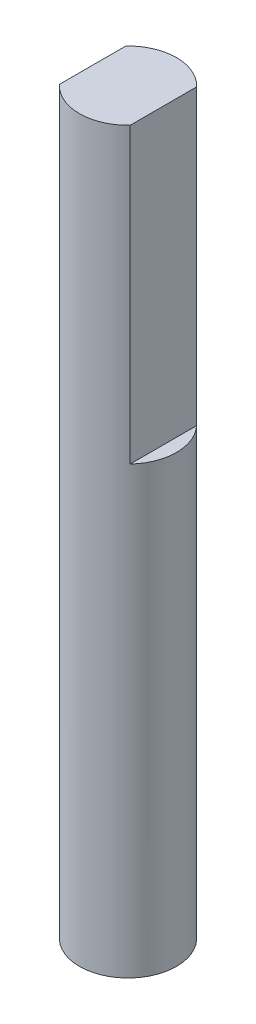
ISO-10303-21;
HEADER;
FILE_DESCRIPTION(('STEP AP214'),'2;1');
FILE_NAME('part.step','',(''),(''),'','','');
FILE_SCHEMA(('AUTOMOTIVE_DESIGN { 1 0 10303 214 1 1 1 1 }'));
ENDSEC;
DATA;
#1=APPLICATION_CONTEXT('core data for automotive mechanical design processes');
#2=APPLICATION_PROTOCOL_DEFINITION('international standard','automotive_design',2000,#1);
#3=PRODUCT_CONTEXT('',#1,'mechanical');
#4=PRODUCT('Part','Part','',(#3));
#5=PRODUCT_RELATED_PRODUCT_CATEGORY('part','',(#4));
#6=PRODUCT_DEFINITION_FORMATION('','',#4);
#7=PRODUCT_DEFINITION_CONTEXT('part definition',#1,'design');
#8=PRODUCT_DEFINITION('design','',#6,#7);
#9=PRODUCT_DEFINITION_SHAPE('','',#8);
#10=(LENGTH_UNIT() NAMED_UNIT(*) SI_UNIT(.MILLI.,.METRE.));
#11=(NAMED_UNIT(*) PLANE_ANGLE_UNIT() SI_UNIT($,.RADIAN.));
#12=(NAMED_UNIT(*) SI_UNIT($,.STERADIAN.) SOLID_ANGLE_UNIT());
#13=UNCERTAINTY_MEASURE_WITH_UNIT(LENGTH_MEASURE(1.E-05),#10,'distance_accuracy_value','');
#14=(GEOMETRIC_REPRESENTATION_CONTEXT(3) GLOBAL_UNCERTAINTY_ASSIGNED_CONTEXT((#13)) GLOBAL_UNIT_ASSIGNED_CONTEXT((#10,
#11,#12)) REPRESENTATION_CONTEXT('',''));
#15=CARTESIAN_POINT('',(0.,0.,0.));
#16=DIRECTION('',(0.,0.,1.));
#17=DIRECTION('',(1.,0.,0.));
#18=AXIS2_PLACEMENT_3D('',#15,#16,#17);
#19=CARTESIAN_POINT('',(0.,18.25,0.));
#20=DIRECTION('',(0.,-1.,0.));
#21=DIRECTION('',(0.,0.,-1.));
#22=AXIS2_PLACEMENT_3D('',#19,#20,#21);
#23=CYLINDRICAL_SURFACE('',#22,2.4);
#24=DIRECTION('',(0.,1.,0.));
#25=VECTOR('',#24,1.);
#26=CARTESIAN_POINT('',(1.75,3.75,-1.64240677056568));
#27=LINE('',#26,#25);
#28=CARTESIAN_POINT('',(1.75,3.75,-1.64240677056568));
#29=VERTEX_POINT('',#28);
#30=CARTESIAN_POINT('',(1.75,18.25,-1.64240677056568));
#31=VERTEX_POINT('',#30);
#32=EDGE_CURVE('E85',#29,#31,#27,.T.);
#33=ORIENTED_EDGE('',*,*,#32,.F.);
#34=CARTESIAN_POINT('',(0.,3.75,0.));
#35=DIRECTION('',(0.,1.,0.));
#36=DIRECTION('',(0.,0.,1.));
#37=AXIS2_PLACEMENT_3D('',#34,#35,#36);
#38=CIRCLE('',#37,2.4);
#39=CARTESIAN_POINT('',(1.75,3.75,1.64240677056568));
#40=VERTEX_POINT('',#39);
#41=EDGE_CURVE('E70',#40,#29,#38,.T.);
#42=ORIENTED_EDGE('',*,*,#41,.F.);
#43=DIRECTION('',(0.,1.,0.));
#44=VECTOR('',#43,1.);
#45=CARTESIAN_POINT('',(1.75,3.75,1.64240677056568));
#46=LINE('',#45,#44);
#47=CARTESIAN_POINT('',(1.75,18.25,1.64240677056568));
#48=VERTEX_POINT('',#47);
#49=EDGE_CURVE('E122',#40,#48,#46,.T.);
#50=ORIENTED_EDGE('',*,*,#49,.T.);
#51=CARTESIAN_POINT('',(0.,18.25,0.));
#52=DIRECTION('',(0.,1.,0.));
#53=DIRECTION('',(0.,0.,1.));
#54=AXIS2_PLACEMENT_3D('',#51,#52,#53);
#55=CIRCLE('',#54,2.4);
#56=CARTESIAN_POINT('',(-1.75,18.25,1.64240677056568));
#57=VERTEX_POINT('',#56);
#58=EDGE_CURVE('E121',#57,#48,#55,.T.);
#59=ORIENTED_EDGE('',*,*,#58,.F.);
#60=DIRECTION('',(0.,1.,0.));
#61=VECTOR('',#60,1.);
#62=CARTESIAN_POINT('',(-1.75,3.75,1.64240677056568));
#63=LINE('',#62,#61);
#64=CARTESIAN_POINT('',(-1.75,3.75,1.64240677056568));
#65=VERTEX_POINT('',#64);
#66=EDGE_CURVE('E77',#65,#57,#63,.T.);
#67=ORIENTED_EDGE('',*,*,#66,.F.);
#68=CARTESIAN_POINT('',(-1.75,3.75,-1.64240677056568));
#69=VERTEX_POINT('',#68);
#70=EDGE_CURVE('E12',#69,#65,#38,.T.);
#71=ORIENTED_EDGE('',*,*,#70,.F.);
#72=DIRECTION('',(0.,1.,0.));
#73=VECTOR('',#72,1.);
#74=CARTESIAN_POINT('',(-1.75,3.75,-1.64240677056568));
#75=LINE('',#74,#73);
#76=CARTESIAN_POINT('',(-1.75,18.25,-1.64240677056568));
#77=VERTEX_POINT('',#76);
#78=EDGE_CURVE('E102',#69,#77,#75,.T.);
#79=ORIENTED_EDGE('',*,*,#78,.T.);
#80=EDGE_CURVE('E127',#31,#77,#55,.T.);
#81=ORIENTED_EDGE('',*,*,#80,.F.);
#82=EDGE_LOOP('',(#33,#42,#50,#59,#67,#71,#79,#81));
#83=FACE_BOUND('',#82,.T.);
#84=CARTESIAN_POINT('',(0.,-18.25,0.));
#85=DIRECTION('',(0.,1.,0.));
#86=DIRECTION('',(0.,0.,1.));
#87=AXIS2_PLACEMENT_3D('',#84,#85,#86);
#88=CIRCLE('',#87,2.4);
#89=CARTESIAN_POINT('',(0.,-18.25,2.4));
#90=VERTEX_POINT('',#89);
#91=EDGE_CURVE('E128',#90,#90,#88,.T.);
#92=ORIENTED_EDGE('',*,*,#91,.T.);
#93=EDGE_LOOP('',(#92));
#94=FACE_BOUND('',#93,.T.);
#95=ADVANCED_FACE('F63',(#83,#94),#23,.T.);
#96=CARTESIAN_POINT('',(0.,18.25,0.));
#97=DIRECTION('',(0.,1.,0.));
#98=DIRECTION('',(0.,0.,1.));
#99=AXIS2_PLACEMENT_3D('',#96,#97,#98);
#100=PLANE('',#99);
#101=ORIENTED_EDGE('',*,*,#58,.T.);
#102=DIRECTION('',(0.,0.,-1.));
#103=VECTOR('',#102,1.);
#104=CARTESIAN_POINT('',(1.75,18.25,-1.64240677056568));
#105=LINE('',#104,#103);
#106=EDGE_CURVE('E115',#48,#31,#105,.T.);
#107=ORIENTED_EDGE('',*,*,#106,.T.);
#108=ORIENTED_EDGE('',*,*,#80,.T.);
#109=DIRECTION('',(0.,0.,1.));
#110=VECTOR('',#109,1.);
#111=CARTESIAN_POINT('',(-1.75,18.25,-1.64240677056568));
#112=LINE('',#111,#110);
#113=EDGE_CURVE('E106',#77,#57,#112,.T.);
#114=ORIENTED_EDGE('',*,*,#113,.T.);
#115=EDGE_LOOP('',(#101,#107,#108,#114));
#116=FACE_BOUND('',#115,.T.);
#117=ADVANCED_FACE('F150',(#116),#100,.T.);
#118=CARTESIAN_POINT('',(0.,-18.25,0.));
#119=DIRECTION('',(0.,1.,0.));
#120=DIRECTION('',(0.,0.,1.));
#121=AXIS2_PLACEMENT_3D('',#118,#119,#120);
#122=PLANE('',#121);
#123=ORIENTED_EDGE('',*,*,#91,.F.);
#124=EDGE_LOOP('',(#123));
#125=FACE_BOUND('',#124,.T.);
#126=ADVANCED_FACE('F155',(#125),#122,.F.);
#127=CARTESIAN_POINT('',(-1.75,3.75,-1.64240677056568));
#128=DIRECTION('',(-1.,0.,0.));
#129=DIRECTION('',(0.,0.,1.));
#130=AXIS2_PLACEMENT_3D('',#127,#128,#129);
#131=PLANE('',#130);
#132=ORIENTED_EDGE('',*,*,#113,.F.);
#133=ORIENTED_EDGE('',*,*,#78,.F.);
#134=DIRECTION('',(0.,0.,1.));
#135=VECTOR('',#134,1.);
#136=CARTESIAN_POINT('',(-1.75,3.75,-1.64240677056568));
#137=LINE('',#136,#135);
#138=EDGE_CURVE('E105',#69,#65,#137,.T.);
#139=ORIENTED_EDGE('',*,*,#138,.T.);
#140=ORIENTED_EDGE('',*,*,#66,.T.);
#141=EDGE_LOOP('',(#132,#133,#139,#140));
#142=FACE_BOUND('',#141,.T.);
#143=ADVANCED_FACE('F104',(#142),#131,.T.);
#144=CARTESIAN_POINT('',(0.,3.75,0.));
#145=DIRECTION('',(0.,1.,0.));
#146=DIRECTION('',(0.,0.,1.));
#147=AXIS2_PLACEMENT_3D('',#144,#145,#146);
#148=PLANE('',#147);
#149=ORIENTED_EDGE('',*,*,#70,.T.);
#150=ORIENTED_EDGE('',*,*,#138,.F.);
#151=EDGE_LOOP('',(#149,#150));
#152=FACE_BOUND('',#151,.T.);
#153=ADVANCED_FACE('F114',(#152),#148,.T.);
#154=ORIENTED_EDGE('',*,*,#41,.T.);
#155=DIRECTION('',(0.,0.,-1.));
#156=VECTOR('',#155,1.);
#157=CARTESIAN_POINT('',(1.75,3.75,-1.64240677056568));
#158=LINE('',#157,#156);
#159=EDGE_CURVE('E111',#40,#29,#158,.T.);
#160=ORIENTED_EDGE('',*,*,#159,.F.);
#161=EDGE_LOOP('',(#154,#160));
#162=FACE_BOUND('',#161,.T.);
#163=ADVANCED_FACE('F139',(#162),#148,.T.);
#164=CARTESIAN_POINT('',(1.75,3.75,-1.64240677056568));
#165=DIRECTION('',(1.,0.,0.));
#166=DIRECTION('',(0.,0.,-1.));
#167=AXIS2_PLACEMENT_3D('',#164,#165,#166);
#168=PLANE('',#167);
#169=ORIENTED_EDGE('',*,*,#106,.F.);
#170=ORIENTED_EDGE('',*,*,#49,.F.);
#171=ORIENTED_EDGE('',*,*,#159,.T.);
#172=ORIENTED_EDGE('',*,*,#32,.T.);
#173=EDGE_LOOP('',(#169,#170,#171,#172));
#174=FACE_BOUND('',#173,.T.);
#175=ADVANCED_FACE('F135',(#174),#168,.T.);
#176=CLOSED_SHELL('',(#95,#117,#126,#143,#153,#163,#175));
#177=MANIFOLD_SOLID_BREP('B2',#176);
#178=ADVANCED_BREP_SHAPE_REPRESENTATION('',(#18,#177),#14);
#179=SHAPE_DEFINITION_REPRESENTATION(#9,#178);
ENDSEC;
END-ISO-10303-21;
